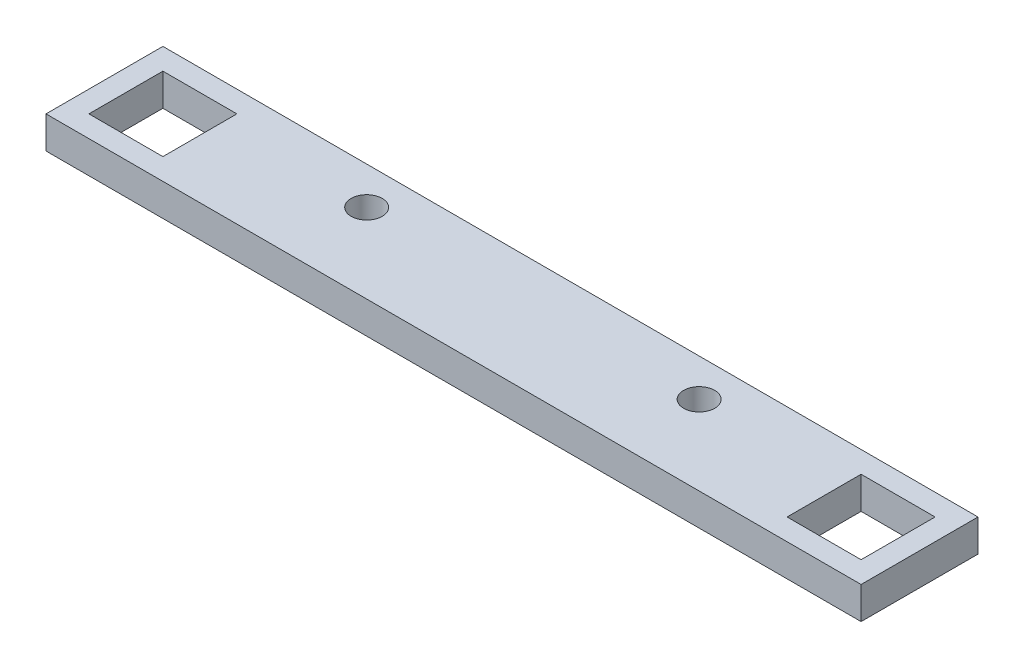
ISO-10303-21;
HEADER;
FILE_DESCRIPTION(('STEP AP214'),'2;1');
FILE_NAME('part.step','',(''),(''),'','','');
FILE_SCHEMA(('AUTOMOTIVE_DESIGN { 1 0 10303 214 1 1 1 1 }'));
ENDSEC;
DATA;
#1=APPLICATION_CONTEXT('core data for automotive mechanical design processes');
#2=APPLICATION_PROTOCOL_DEFINITION('international standard','automotive_design',2000,#1);
#3=PRODUCT_CONTEXT('',#1,'mechanical');
#4=PRODUCT('Part','Part','',(#3));
#5=PRODUCT_RELATED_PRODUCT_CATEGORY('part','',(#4));
#6=PRODUCT_DEFINITION_FORMATION('','',#4);
#7=PRODUCT_DEFINITION_CONTEXT('part definition',#1,'design');
#8=PRODUCT_DEFINITION('design','',#6,#7);
#9=PRODUCT_DEFINITION_SHAPE('','',#8);
#10=(LENGTH_UNIT() NAMED_UNIT(*) SI_UNIT(.MILLI.,.METRE.));
#11=(NAMED_UNIT(*) PLANE_ANGLE_UNIT() SI_UNIT($,.RADIAN.));
#12=(NAMED_UNIT(*) SI_UNIT($,.STERADIAN.) SOLID_ANGLE_UNIT());
#13=UNCERTAINTY_MEASURE_WITH_UNIT(LENGTH_MEASURE(1.E-05),#10,'distance_accuracy_value','');
#14=(GEOMETRIC_REPRESENTATION_CONTEXT(3) GLOBAL_UNCERTAINTY_ASSIGNED_CONTEXT((#13)) GLOBAL_UNIT_ASSIGNED_CONTEXT((#10,
#11,#12)) REPRESENTATION_CONTEXT('',''));
#15=CARTESIAN_POINT('',(0.,0.,0.));
#16=DIRECTION('',(0.,0.,1.));
#17=DIRECTION('',(1.,0.,0.));
#18=AXIS2_PLACEMENT_3D('',#15,#16,#17);
#19=CARTESIAN_POINT('',(0.,3.,0.));
#20=DIRECTION('',(0.,-1.,0.));
#21=DIRECTION('',(0.,0.,-1.));
#22=AXIS2_PLACEMENT_3D('',#19,#20,#21);
#23=PLANE('',#22);
#24=DIRECTION('',(0.,0.,1.));
#25=VECTOR('',#24,1.);
#26=CARTESIAN_POINT('',(2.,3.,-2.));
#27=LINE('',#26,#25);
#28=CARTESIAN_POINT('',(2.,3.,-8.9));
#29=VERTEX_POINT('',#28);
#30=CARTESIAN_POINT('',(2.,3.,-2.));
#31=VERTEX_POINT('',#30);
#32=EDGE_CURVE('E163',#29,#31,#27,.T.);
#33=ORIENTED_EDGE('',*,*,#32,.F.);
#34=DIRECTION('',(-1.,0.,0.));
#35=VECTOR('',#34,1.);
#36=CARTESIAN_POINT('',(2.,3.,-8.9));
#37=LINE('',#36,#35);
#38=CARTESIAN_POINT('',(8.89999999999999,3.,-8.9));
#39=VERTEX_POINT('',#38);
#40=EDGE_CURVE('E171',#39,#29,#37,.T.);
#41=ORIENTED_EDGE('',*,*,#40,.F.);
#42=DIRECTION('',(0.,0.,-1.));
#43=VECTOR('',#42,1.);
#44=CARTESIAN_POINT('',(8.89999999999999,3.,-2.));
#45=LINE('',#44,#43);
#46=CARTESIAN_POINT('',(8.89999999999999,3.,-2.));
#47=VERTEX_POINT('',#46);
#48=EDGE_CURVE('E168',#47,#39,#45,.T.);
#49=ORIENTED_EDGE('',*,*,#48,.F.);
#50=DIRECTION('',(1.,0.,0.));
#51=VECTOR('',#50,1.);
#52=CARTESIAN_POINT('',(2.,3.,-2.));
#53=LINE('',#52,#51);
#54=EDGE_CURVE('E165',#31,#47,#53,.T.);
#55=ORIENTED_EDGE('',*,*,#54,.F.);
#56=EDGE_LOOP('',(#33,#41,#49,#55));
#57=FACE_BOUND('',#56,.T.);
#58=DIRECTION('',(0.,0.,1.));
#59=VECTOR('',#58,1.);
#60=CARTESIAN_POINT('',(0.,3.,0.));
#61=LINE('',#60,#59);
#62=CARTESIAN_POINT('',(0.,3.,-10.9));
#63=VERTEX_POINT('',#62);
#64=CARTESIAN_POINT('',(0.,3.,0.));
#65=VERTEX_POINT('',#64);
#66=EDGE_CURVE('E194',#63,#65,#61,.T.);
#67=ORIENTED_EDGE('',*,*,#66,.T.);
#68=DIRECTION('',(1.,0.,0.));
#69=VECTOR('',#68,1.);
#70=CARTESIAN_POINT('',(0.,3.,0.));
#71=LINE('',#70,#69);
#72=CARTESIAN_POINT('',(76.,3.,0.));
#73=VERTEX_POINT('',#72);
#74=EDGE_CURVE('E197',#65,#73,#71,.T.);
#75=ORIENTED_EDGE('',*,*,#74,.T.);
#76=DIRECTION('',(0.,0.,-1.));
#77=VECTOR('',#76,1.);
#78=CARTESIAN_POINT('',(76.,3.,0.));
#79=LINE('',#78,#77);
#80=CARTESIAN_POINT('',(76.,3.,-10.9));
#81=VERTEX_POINT('',#80);
#82=EDGE_CURVE('E200',#73,#81,#79,.T.);
#83=ORIENTED_EDGE('',*,*,#82,.T.);
#84=DIRECTION('',(-1.,0.,0.));
#85=VECTOR('',#84,1.);
#86=CARTESIAN_POINT('',(0.,3.,-10.9));
#87=LINE('',#86,#85);
#88=EDGE_CURVE('E202',#81,#63,#87,.T.);
#89=ORIENTED_EDGE('',*,*,#88,.T.);
#90=EDGE_LOOP('',(#67,#75,#83,#89));
#91=FACE_BOUND('',#90,.T.);
#92=DIRECTION('',(0.,0.,-1.));
#93=VECTOR('',#92,1.);
#94=CARTESIAN_POINT('',(74.,3.,-2.00000000000001));
#95=LINE('',#94,#93);
#96=CARTESIAN_POINT('',(74.,3.,-2.00000000000001));
#97=VERTEX_POINT('',#96);
#98=CARTESIAN_POINT('',(74.,3.,-8.90000000000001));
#99=VERTEX_POINT('',#98);
#100=EDGE_CURVE('E124',#97,#99,#95,.T.);
#101=ORIENTED_EDGE('',*,*,#100,.F.);
#102=DIRECTION('',(1.,0.,0.));
#103=VECTOR('',#102,1.);
#104=CARTESIAN_POINT('',(74.,3.,-2.00000000000001));
#105=LINE('',#104,#103);
#106=CARTESIAN_POINT('',(67.1,3.,-2.));
#107=VERTEX_POINT('',#106);
#108=EDGE_CURVE('E147',#107,#97,#105,.T.);
#109=ORIENTED_EDGE('',*,*,#108,.F.);
#110=DIRECTION('',(0.,0.,1.));
#111=VECTOR('',#110,1.);
#112=CARTESIAN_POINT('',(67.1,3.,-2.));
#113=LINE('',#112,#111);
#114=CARTESIAN_POINT('',(67.1,3.,-8.9));
#115=VERTEX_POINT('',#114);
#116=EDGE_CURVE('E145',#115,#107,#113,.T.);
#117=ORIENTED_EDGE('',*,*,#116,.F.);
#118=DIRECTION('',(-1.,0.,0.));
#119=VECTOR('',#118,1.);
#120=CARTESIAN_POINT('',(74.,3.,-8.90000000000001));
#121=LINE('',#120,#119);
#122=EDGE_CURVE('E132',#99,#115,#121,.T.);
#123=ORIENTED_EDGE('',*,*,#122,.F.);
#124=EDGE_LOOP('',(#101,#109,#117,#123));
#125=FACE_BOUND('',#124,.T.);
#126=CARTESIAN_POINT('',(22.5,3.,-7.4));
#127=DIRECTION('',(0.,1.,0.));
#128=DIRECTION('',(0.,0.,1.));
#129=AXIS2_PLACEMENT_3D('',#126,#127,#128);
#130=CIRCLE('',#129,1.45);
#131=CARTESIAN_POINT('',(22.5,3.,-5.95));
#132=VERTEX_POINT('',#131);
#133=EDGE_CURVE('E153',#132,#132,#130,.T.);
#134=ORIENTED_EDGE('',*,*,#133,.F.);
#135=EDGE_LOOP('',(#134));
#136=FACE_BOUND('',#135,.T.);
#137=CARTESIAN_POINT('',(53.5,3.,-7.4));
#138=DIRECTION('',(0.,1.,0.));
#139=DIRECTION('',(0.,0.,1.));
#140=AXIS2_PLACEMENT_3D('',#137,#138,#139);
#141=CIRCLE('',#140,1.45);
#142=CARTESIAN_POINT('',(53.5,3.,-5.95));
#143=VERTEX_POINT('',#142);
#144=EDGE_CURVE('E310',#143,#143,#141,.T.);
#145=ORIENTED_EDGE('',*,*,#144,.F.);
#146=EDGE_LOOP('',(#145));
#147=FACE_BOUND('',#146,.T.);
#148=ADVANCED_FACE('F35',(#57,#91,#125,#136,#147),#23,.F.);
#149=CARTESIAN_POINT('',(0.,0.,0.));
#150=DIRECTION('',(0.,-1.,0.));
#151=DIRECTION('',(0.,0.,-1.));
#152=AXIS2_PLACEMENT_3D('',#149,#150,#151);
#153=PLANE('',#152);
#154=CARTESIAN_POINT('',(22.5,0.,-7.4));
#155=DIRECTION('',(0.,1.,0.));
#156=DIRECTION('',(0.,0.,1.));
#157=AXIS2_PLACEMENT_3D('',#154,#155,#156);
#158=CIRCLE('',#157,1.45);
#159=CARTESIAN_POINT('',(22.5,0.,-5.95));
#160=VERTEX_POINT('',#159);
#161=EDGE_CURVE('E316',#160,#160,#158,.T.);
#162=ORIENTED_EDGE('',*,*,#161,.T.);
#163=EDGE_LOOP('',(#162));
#164=FACE_BOUND('',#163,.T.);
#165=DIRECTION('',(0.,0.,1.));
#166=VECTOR('',#165,1.);
#167=CARTESIAN_POINT('',(0.,0.,0.));
#168=LINE('',#167,#166);
#169=CARTESIAN_POINT('',(0.,0.,-10.9));
#170=VERTEX_POINT('',#169);
#171=CARTESIAN_POINT('',(0.,0.,0.));
#172=VERTEX_POINT('',#171);
#173=EDGE_CURVE('E193',#170,#172,#168,.T.);
#174=ORIENTED_EDGE('',*,*,#173,.F.);
#175=DIRECTION('',(-1.,0.,0.));
#176=VECTOR('',#175,1.);
#177=CARTESIAN_POINT('',(0.,0.,-10.9));
#178=LINE('',#177,#176);
#179=CARTESIAN_POINT('',(76.,0.,-10.9));
#180=VERTEX_POINT('',#179);
#181=EDGE_CURVE('E198',#180,#170,#178,.T.);
#182=ORIENTED_EDGE('',*,*,#181,.F.);
#183=DIRECTION('',(0.,0.,-1.));
#184=VECTOR('',#183,1.);
#185=CARTESIAN_POINT('',(76.,0.,0.));
#186=LINE('',#185,#184);
#187=CARTESIAN_POINT('',(76.,0.,0.));
#188=VERTEX_POINT('',#187);
#189=EDGE_CURVE('E209',#188,#180,#186,.T.);
#190=ORIENTED_EDGE('',*,*,#189,.F.);
#191=DIRECTION('',(1.,0.,0.));
#192=VECTOR('',#191,1.);
#193=CARTESIAN_POINT('',(0.,0.,0.));
#194=LINE('',#193,#192);
#195=EDGE_CURVE('E207',#172,#188,#194,.T.);
#196=ORIENTED_EDGE('',*,*,#195,.F.);
#197=EDGE_LOOP('',(#174,#182,#190,#196));
#198=FACE_BOUND('',#197,.T.);
#199=DIRECTION('',(-1.,0.,0.));
#200=VECTOR('',#199,1.);
#201=CARTESIAN_POINT('',(2.,0.,-8.9));
#202=LINE('',#201,#200);
#203=CARTESIAN_POINT('',(8.89999999999999,0.,-8.9));
#204=VERTEX_POINT('',#203);
#205=CARTESIAN_POINT('',(2.,0.,-8.9));
#206=VERTEX_POINT('',#205);
#207=EDGE_CURVE('E166',#204,#206,#202,.T.);
#208=ORIENTED_EDGE('',*,*,#207,.T.);
#209=DIRECTION('',(0.,0.,1.));
#210=VECTOR('',#209,1.);
#211=CARTESIAN_POINT('',(2.,0.,-2.));
#212=LINE('',#211,#210);
#213=CARTESIAN_POINT('',(2.,0.,-2.));
#214=VERTEX_POINT('',#213);
#215=EDGE_CURVE('E140',#206,#214,#212,.T.);
#216=ORIENTED_EDGE('',*,*,#215,.T.);
#217=DIRECTION('',(1.,0.,0.));
#218=VECTOR('',#217,1.);
#219=CARTESIAN_POINT('',(2.,0.,-2.));
#220=LINE('',#219,#218);
#221=CARTESIAN_POINT('',(8.89999999999999,0.,-2.));
#222=VERTEX_POINT('',#221);
#223=EDGE_CURVE('E176',#214,#222,#220,.T.);
#224=ORIENTED_EDGE('',*,*,#223,.T.);
#225=DIRECTION('',(0.,0.,-1.));
#226=VECTOR('',#225,1.);
#227=CARTESIAN_POINT('',(8.89999999999999,0.,-2.));
#228=LINE('',#227,#226);
#229=EDGE_CURVE('E179',#222,#204,#228,.T.);
#230=ORIENTED_EDGE('',*,*,#229,.T.);
#231=EDGE_LOOP('',(#208,#216,#224,#230));
#232=FACE_BOUND('',#231,.T.);
#233=DIRECTION('',(1.,0.,0.));
#234=VECTOR('',#233,1.);
#235=CARTESIAN_POINT('',(74.,0.,-2.00000000000001));
#236=LINE('',#235,#234);
#237=CARTESIAN_POINT('',(67.1,0.,-2.));
#238=VERTEX_POINT('',#237);
#239=CARTESIAN_POINT('',(74.,0.,-2.00000000000001));
#240=VERTEX_POINT('',#239);
#241=EDGE_CURVE('E133',#238,#240,#236,.T.);
#242=ORIENTED_EDGE('',*,*,#241,.T.);
#243=DIRECTION('',(0.,0.,-1.));
#244=VECTOR('',#243,1.);
#245=CARTESIAN_POINT('',(74.,0.,-2.00000000000001));
#246=LINE('',#245,#244);
#247=CARTESIAN_POINT('',(74.,0.,-8.90000000000001));
#248=VERTEX_POINT('',#247);
#249=EDGE_CURVE('E58',#240,#248,#246,.T.);
#250=ORIENTED_EDGE('',*,*,#249,.T.);
#251=DIRECTION('',(-1.,0.,0.));
#252=VECTOR('',#251,1.);
#253=CARTESIAN_POINT('',(74.,0.,-8.90000000000001));
#254=LINE('',#253,#252);
#255=CARTESIAN_POINT('',(67.1,0.,-8.9));
#256=VERTEX_POINT('',#255);
#257=EDGE_CURVE('E139',#248,#256,#254,.T.);
#258=ORIENTED_EDGE('',*,*,#257,.T.);
#259=DIRECTION('',(0.,0.,1.));
#260=VECTOR('',#259,1.);
#261=CARTESIAN_POINT('',(67.1,0.,-2.));
#262=LINE('',#261,#260);
#263=EDGE_CURVE('E155',#256,#238,#262,.T.);
#264=ORIENTED_EDGE('',*,*,#263,.T.);
#265=EDGE_LOOP('',(#242,#250,#258,#264));
#266=FACE_BOUND('',#265,.T.);
#267=CARTESIAN_POINT('',(53.5,0.,-7.4));
#268=DIRECTION('',(0.,1.,0.));
#269=DIRECTION('',(0.,0.,1.));
#270=AXIS2_PLACEMENT_3D('',#267,#268,#269);
#271=CIRCLE('',#270,1.45);
#272=CARTESIAN_POINT('',(53.5,0.,-5.95));
#273=VERTEX_POINT('',#272);
#274=EDGE_CURVE('E313',#273,#273,#271,.T.);
#275=ORIENTED_EDGE('',*,*,#274,.T.);
#276=EDGE_LOOP('',(#275));
#277=FACE_BOUND('',#276,.T.);
#278=ADVANCED_FACE('F227',(#164,#198,#232,#266,#277),#153,.T.);
#279=CARTESIAN_POINT('',(0.,3.,0.));
#280=DIRECTION('',(1.,0.,0.));
#281=DIRECTION('',(0.,0.,-1.));
#282=AXIS2_PLACEMENT_3D('',#279,#280,#281);
#283=PLANE('',#282);
#284=ORIENTED_EDGE('',*,*,#173,.T.);
#285=DIRECTION('',(0.,-1.,0.));
#286=VECTOR('',#285,1.);
#287=CARTESIAN_POINT('',(0.,3.,0.));
#288=LINE('',#287,#286);
#289=EDGE_CURVE('E11',#65,#172,#288,.T.);
#290=ORIENTED_EDGE('',*,*,#289,.F.);
#291=ORIENTED_EDGE('',*,*,#66,.F.);
#292=DIRECTION('',(0.,-1.,0.));
#293=VECTOR('',#292,1.);
#294=CARTESIAN_POINT('',(0.,3.,-10.9));
#295=LINE('',#294,#293);
#296=EDGE_CURVE('E204',#63,#170,#295,.T.);
#297=ORIENTED_EDGE('',*,*,#296,.T.);
#298=EDGE_LOOP('',(#284,#290,#291,#297));
#299=FACE_BOUND('',#298,.T.);
#300=ADVANCED_FACE('F37',(#299),#283,.F.);
#301=CARTESIAN_POINT('',(0.,3.,0.));
#302=DIRECTION('',(0.,0.,-1.));
#303=DIRECTION('',(-1.,0.,0.));
#304=AXIS2_PLACEMENT_3D('',#301,#302,#303);
#305=PLANE('',#304);
#306=ORIENTED_EDGE('',*,*,#195,.T.);
#307=DIRECTION('',(0.,-1.,0.));
#308=VECTOR('',#307,1.);
#309=CARTESIAN_POINT('',(76.,3.,0.));
#310=LINE('',#309,#308);
#311=EDGE_CURVE('E43',#73,#188,#310,.T.);
#312=ORIENTED_EDGE('',*,*,#311,.F.);
#313=ORIENTED_EDGE('',*,*,#74,.F.);
#314=ORIENTED_EDGE('',*,*,#289,.T.);
#315=EDGE_LOOP('',(#306,#312,#313,#314));
#316=FACE_BOUND('',#315,.T.);
#317=ADVANCED_FACE('F237',(#316),#305,.F.);
#318=CARTESIAN_POINT('',(76.,3.,0.));
#319=DIRECTION('',(-1.,0.,0.));
#320=DIRECTION('',(0.,0.,1.));
#321=AXIS2_PLACEMENT_3D('',#318,#319,#320);
#322=PLANE('',#321);
#323=ORIENTED_EDGE('',*,*,#189,.T.);
#324=DIRECTION('',(0.,-1.,0.));
#325=VECTOR('',#324,1.);
#326=CARTESIAN_POINT('',(76.,3.,-10.9));
#327=LINE('',#326,#325);
#328=EDGE_CURVE('E214',#81,#180,#327,.T.);
#329=ORIENTED_EDGE('',*,*,#328,.F.);
#330=ORIENTED_EDGE('',*,*,#82,.F.);
#331=ORIENTED_EDGE('',*,*,#311,.T.);
#332=EDGE_LOOP('',(#323,#329,#330,#331));
#333=FACE_BOUND('',#332,.T.);
#334=ADVANCED_FACE('F221',(#333),#322,.F.);
#335=CARTESIAN_POINT('',(0.,3.,-10.9));
#336=DIRECTION('',(0.,0.,1.));
#337=DIRECTION('',(1.,0.,0.));
#338=AXIS2_PLACEMENT_3D('',#335,#336,#337);
#339=PLANE('',#338);
#340=ORIENTED_EDGE('',*,*,#181,.T.);
#341=ORIENTED_EDGE('',*,*,#296,.F.);
#342=ORIENTED_EDGE('',*,*,#88,.F.);
#343=ORIENTED_EDGE('',*,*,#328,.T.);
#344=EDGE_LOOP('',(#340,#341,#342,#343));
#345=FACE_BOUND('',#344,.T.);
#346=ADVANCED_FACE('F231',(#345),#339,.F.);
#347=CARTESIAN_POINT('',(2.,3.,-2.));
#348=DIRECTION('',(1.,0.,0.));
#349=DIRECTION('',(0.,0.,-1.));
#350=AXIS2_PLACEMENT_3D('',#347,#348,#349);
#351=PLANE('',#350);
#352=ORIENTED_EDGE('',*,*,#215,.F.);
#353=DIRECTION('',(0.,-1.,0.));
#354=VECTOR('',#353,1.);
#355=CARTESIAN_POINT('',(2.,3.,-8.9));
#356=LINE('',#355,#354);
#357=EDGE_CURVE('E173',#29,#206,#356,.T.);
#358=ORIENTED_EDGE('',*,*,#357,.F.);
#359=ORIENTED_EDGE('',*,*,#32,.T.);
#360=DIRECTION('',(0.,-1.,0.));
#361=VECTOR('',#360,1.);
#362=CARTESIAN_POINT('',(2.,3.,-2.));
#363=LINE('',#362,#361);
#364=EDGE_CURVE('E190',#31,#214,#363,.T.);
#365=ORIENTED_EDGE('',*,*,#364,.T.);
#366=EDGE_LOOP('',(#352,#358,#359,#365));
#367=FACE_BOUND('',#366,.T.);
#368=ADVANCED_FACE('F254',(#367),#351,.T.);
#369=CARTESIAN_POINT('',(2.,3.,-2.));
#370=DIRECTION('',(0.,0.,-1.));
#371=DIRECTION('',(-1.,0.,0.));
#372=AXIS2_PLACEMENT_3D('',#369,#370,#371);
#373=PLANE('',#372);
#374=ORIENTED_EDGE('',*,*,#223,.F.);
#375=ORIENTED_EDGE('',*,*,#364,.F.);
#376=ORIENTED_EDGE('',*,*,#54,.T.);
#377=DIRECTION('',(0.,-1.,0.));
#378=VECTOR('',#377,1.);
#379=CARTESIAN_POINT('',(8.89999999999999,3.,-2.));
#380=LINE('',#379,#378);
#381=EDGE_CURVE('E188',#47,#222,#380,.T.);
#382=ORIENTED_EDGE('',*,*,#381,.T.);
#383=EDGE_LOOP('',(#374,#375,#376,#382));
#384=FACE_BOUND('',#383,.T.);
#385=ADVANCED_FACE('F261',(#384),#373,.T.);
#386=CARTESIAN_POINT('',(8.89999999999999,3.,-2.));
#387=DIRECTION('',(-1.,0.,0.));
#388=DIRECTION('',(0.,0.,1.));
#389=AXIS2_PLACEMENT_3D('',#386,#387,#388);
#390=PLANE('',#389);
#391=ORIENTED_EDGE('',*,*,#229,.F.);
#392=ORIENTED_EDGE('',*,*,#381,.F.);
#393=ORIENTED_EDGE('',*,*,#48,.T.);
#394=DIRECTION('',(0.,-1.,0.));
#395=VECTOR('',#394,1.);
#396=CARTESIAN_POINT('',(8.89999999999999,3.,-8.9));
#397=LINE('',#396,#395);
#398=EDGE_CURVE('E186',#39,#204,#397,.T.);
#399=ORIENTED_EDGE('',*,*,#398,.T.);
#400=EDGE_LOOP('',(#391,#392,#393,#399));
#401=FACE_BOUND('',#400,.T.);
#402=ADVANCED_FACE('F266',(#401),#390,.T.);
#403=CARTESIAN_POINT('',(2.,3.,-8.9));
#404=DIRECTION('',(0.,0.,1.));
#405=DIRECTION('',(1.,0.,0.));
#406=AXIS2_PLACEMENT_3D('',#403,#404,#405);
#407=PLANE('',#406);
#408=ORIENTED_EDGE('',*,*,#207,.F.);
#409=ORIENTED_EDGE('',*,*,#398,.F.);
#410=ORIENTED_EDGE('',*,*,#40,.T.);
#411=ORIENTED_EDGE('',*,*,#357,.T.);
#412=EDGE_LOOP('',(#408,#409,#410,#411));
#413=FACE_BOUND('',#412,.T.);
#414=ADVANCED_FACE('F272',(#413),#407,.T.);
#415=CARTESIAN_POINT('',(74.,3.,-2.00000000000001));
#416=DIRECTION('',(-1.,0.,0.));
#417=DIRECTION('',(0.,0.,1.));
#418=AXIS2_PLACEMENT_3D('',#415,#416,#417);
#419=PLANE('',#418);
#420=ORIENTED_EDGE('',*,*,#249,.F.);
#421=DIRECTION('',(0.,-1.,0.));
#422=VECTOR('',#421,1.);
#423=CARTESIAN_POINT('',(74.,3.,-2.00000000000001));
#424=LINE('',#423,#422);
#425=EDGE_CURVE('E128',#97,#240,#424,.T.);
#426=ORIENTED_EDGE('',*,*,#425,.F.);
#427=ORIENTED_EDGE('',*,*,#100,.T.);
#428=DIRECTION('',(0.,-1.,0.));
#429=VECTOR('',#428,1.);
#430=CARTESIAN_POINT('',(74.,3.,-8.90000000000001));
#431=LINE('',#430,#429);
#432=EDGE_CURVE('E127',#99,#248,#431,.T.);
#433=ORIENTED_EDGE('',*,*,#432,.T.);
#434=EDGE_LOOP('',(#420,#426,#427,#433));
#435=FACE_BOUND('',#434,.T.);
#436=ADVANCED_FACE('F126',(#435),#419,.T.);
#437=CARTESIAN_POINT('',(74.,3.,-8.90000000000001));
#438=DIRECTION('',(0.,0.,1.));
#439=DIRECTION('',(1.,0.,0.));
#440=AXIS2_PLACEMENT_3D('',#437,#438,#439);
#441=PLANE('',#440);
#442=ORIENTED_EDGE('',*,*,#257,.F.);
#443=ORIENTED_EDGE('',*,*,#432,.F.);
#444=ORIENTED_EDGE('',*,*,#122,.T.);
#445=DIRECTION('',(0.,-1.,0.));
#446=VECTOR('',#445,1.);
#447=CARTESIAN_POINT('',(67.1,3.,-8.9));
#448=LINE('',#447,#446);
#449=EDGE_CURVE('E141',#115,#256,#448,.T.);
#450=ORIENTED_EDGE('',*,*,#449,.T.);
#451=EDGE_LOOP('',(#442,#443,#444,#450));
#452=FACE_BOUND('',#451,.T.);
#453=ADVANCED_FACE('F136',(#452),#441,.T.);
#454=CARTESIAN_POINT('',(67.1,3.,-2.));
#455=DIRECTION('',(1.,0.,0.));
#456=DIRECTION('',(0.,0.,-1.));
#457=AXIS2_PLACEMENT_3D('',#454,#455,#456);
#458=PLANE('',#457);
#459=ORIENTED_EDGE('',*,*,#263,.F.);
#460=ORIENTED_EDGE('',*,*,#449,.F.);
#461=ORIENTED_EDGE('',*,*,#116,.T.);
#462=DIRECTION('',(0.,-1.,0.));
#463=VECTOR('',#462,1.);
#464=CARTESIAN_POINT('',(67.1,3.,-2.));
#465=LINE('',#464,#463);
#466=EDGE_CURVE('E50',#107,#238,#465,.T.);
#467=ORIENTED_EDGE('',*,*,#466,.T.);
#468=EDGE_LOOP('',(#459,#460,#461,#467));
#469=FACE_BOUND('',#468,.T.);
#470=ADVANCED_FACE('F291',(#469),#458,.T.);
#471=CARTESIAN_POINT('',(74.,3.,-2.00000000000001));
#472=DIRECTION('',(0.,0.,-1.));
#473=DIRECTION('',(-1.,0.,0.));
#474=AXIS2_PLACEMENT_3D('',#471,#472,#473);
#475=PLANE('',#474);
#476=ORIENTED_EDGE('',*,*,#241,.F.);
#477=ORIENTED_EDGE('',*,*,#466,.F.);
#478=ORIENTED_EDGE('',*,*,#108,.T.);
#479=ORIENTED_EDGE('',*,*,#425,.T.);
#480=EDGE_LOOP('',(#476,#477,#478,#479));
#481=FACE_BOUND('',#480,.T.);
#482=ADVANCED_FACE('F294',(#481),#475,.T.);
#483=CARTESIAN_POINT('',(22.5,3.,-7.4));
#484=DIRECTION('',(0.,-1.,0.));
#485=DIRECTION('',(0.,0.,-1.));
#486=AXIS2_PLACEMENT_3D('',#483,#484,#485);
#487=CYLINDRICAL_SURFACE('',#486,1.45);
#488=ORIENTED_EDGE('',*,*,#133,.T.);
#489=EDGE_LOOP('',(#488));
#490=FACE_BOUND('',#489,.T.);
#491=ORIENTED_EDGE('',*,*,#161,.F.);
#492=EDGE_LOOP('',(#491));
#493=FACE_BOUND('',#492,.T.);
#494=ADVANCED_FACE('F298',(#490,#493),#487,.F.);
#495=CARTESIAN_POINT('',(53.5,3.,-7.4));
#496=DIRECTION('',(0.,-1.,0.));
#497=DIRECTION('',(0.,0.,-1.));
#498=AXIS2_PLACEMENT_3D('',#495,#496,#497);
#499=CYLINDRICAL_SURFACE('',#498,1.45);
#500=ORIENTED_EDGE('',*,*,#144,.T.);
#501=EDGE_LOOP('',(#500));
#502=FACE_BOUND('',#501,.T.);
#503=ORIENTED_EDGE('',*,*,#274,.F.);
#504=EDGE_LOOP('',(#503));
#505=FACE_BOUND('',#504,.T.);
#506=ADVANCED_FACE('F301',(#502,#505),#499,.F.);
#507=CLOSED_SHELL('',(#148,#278,#300,#317,#334,#346,#368,#385,#402,#414,#436,#453,#470,#482,
#494,#506));
#508=MANIFOLD_SOLID_BREP('B2',#507);
#509=ADVANCED_BREP_SHAPE_REPRESENTATION('',(#18,#508),#14);
#510=SHAPE_DEFINITION_REPRESENTATION(#9,#509);
ENDSEC;
END-ISO-10303-21;
